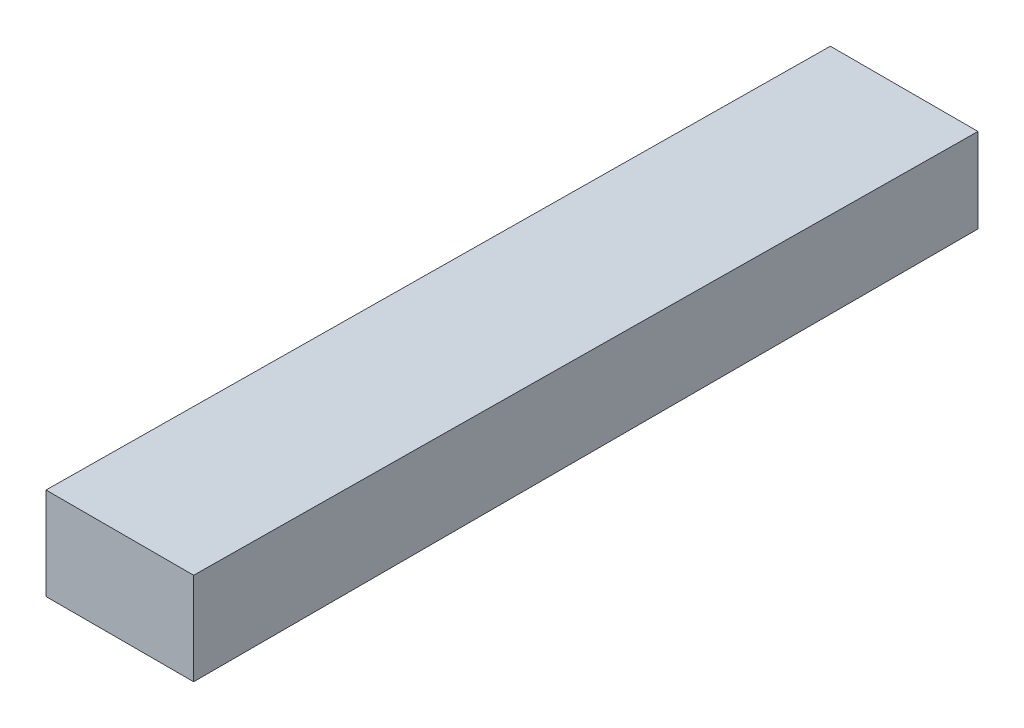
ISO-10303-21;
HEADER;
FILE_DESCRIPTION(('STEP AP214'),'2;1');
FILE_NAME('part.step','',(''),(''),'','','');
FILE_SCHEMA(('AUTOMOTIVE_DESIGN { 1 0 10303 214 1 1 1 1 }'));
ENDSEC;
DATA;
#1=APPLICATION_CONTEXT('core data for automotive mechanical design processes');
#2=APPLICATION_PROTOCOL_DEFINITION('international standard','automotive_design',2000,#1);
#3=PRODUCT_CONTEXT('',#1,'mechanical');
#4=PRODUCT('Part','Part','',(#3));
#5=PRODUCT_RELATED_PRODUCT_CATEGORY('part','',(#4));
#6=PRODUCT_DEFINITION_FORMATION('','',#4);
#7=PRODUCT_DEFINITION_CONTEXT('part definition',#1,'design');
#8=PRODUCT_DEFINITION('design','',#6,#7);
#9=PRODUCT_DEFINITION_SHAPE('','',#8);
#10=(LENGTH_UNIT() NAMED_UNIT(*) SI_UNIT(.MILLI.,.METRE.));
#11=(NAMED_UNIT(*) PLANE_ANGLE_UNIT() SI_UNIT($,.RADIAN.));
#12=(NAMED_UNIT(*) SI_UNIT($,.STERADIAN.) SOLID_ANGLE_UNIT());
#13=UNCERTAINTY_MEASURE_WITH_UNIT(LENGTH_MEASURE(1.E-05),#10,'distance_accuracy_value','');
#14=(GEOMETRIC_REPRESENTATION_CONTEXT(3) GLOBAL_UNCERTAINTY_ASSIGNED_CONTEXT((#13)) GLOBAL_UNIT_ASSIGNED_CONTEXT((#10,
#11,#12)) REPRESENTATION_CONTEXT('',''));
#15=CARTESIAN_POINT('',(0.,0.,0.));
#16=DIRECTION('',(0.,0.,1.));
#17=DIRECTION('',(1.,0.,0.));
#18=AXIS2_PLACEMENT_3D('',#15,#16,#17);
#19=CARTESIAN_POINT('',(0.,0.,42.5));
#20=DIRECTION('',(1.,0.,0.));
#21=DIRECTION('',(0.,0.,-1.));
#22=AXIS2_PLACEMENT_3D('',#19,#20,#21);
#23=PLANE('',#22);
#24=DIRECTION('',(0.,-1.,0.));
#25=VECTOR('',#24,1.);
#26=CARTESIAN_POINT('',(0.,0.,42.5));
#27=LINE('',#26,#25);
#28=CARTESIAN_POINT('',(0.,10.,42.5));
#29=VERTEX_POINT('',#28);
#30=CARTESIAN_POINT('',(0.,0.,42.5));
#31=VERTEX_POINT('',#30);
#32=EDGE_CURVE('E102',#29,#31,#27,.T.);
#33=ORIENTED_EDGE('',*,*,#32,.F.);
#34=DIRECTION('',(0.,0.00999950003749688,0.999950003749687));
#35=VECTOR('',#34,1.);
#36=CARTESIAN_POINT('',(0.,9.15,-42.5));
#37=LINE('',#36,#35);
#38=CARTESIAN_POINT('',(0.,9.15,-42.5));
#39=VERTEX_POINT('',#38);
#40=EDGE_CURVE('E120',#39,#29,#37,.T.);
#41=ORIENTED_EDGE('',*,*,#40,.F.);
#42=DIRECTION('',(0.,-1.,0.));
#43=VECTOR('',#42,1.);
#44=CARTESIAN_POINT('',(0.,0.,-42.5));
#45=LINE('',#44,#43);
#46=CARTESIAN_POINT('',(0.,0.,-42.5));
#47=VERTEX_POINT('',#46);
#48=EDGE_CURVE('E91',#39,#47,#45,.T.);
#49=ORIENTED_EDGE('',*,*,#48,.T.);
#50=DIRECTION('',(0.,0.,-1.));
#51=VECTOR('',#50,1.);
#52=CARTESIAN_POINT('',(0.,0.,42.5));
#53=LINE('',#52,#51);
#54=EDGE_CURVE('E52',#31,#47,#53,.T.);
#55=ORIENTED_EDGE('',*,*,#54,.F.);
#56=EDGE_LOOP('',(#33,#41,#49,#55));
#57=FACE_BOUND('',#56,.T.);
#58=ADVANCED_FACE('F44',(#57),#23,.F.);
#59=CARTESIAN_POINT('',(0.,0.,42.5));
#60=DIRECTION('',(0.,1.,0.));
#61=DIRECTION('',(0.,0.,1.));
#62=AXIS2_PLACEMENT_3D('',#59,#60,#61);
#63=PLANE('',#62);
#64=DIRECTION('',(1.,0.,0.));
#65=VECTOR('',#64,1.);
#66=CARTESIAN_POINT('',(0.,0.,-42.5));
#67=LINE('',#66,#65);
#68=CARTESIAN_POINT('',(16.,0.,-42.5));
#69=VERTEX_POINT('',#68);
#70=EDGE_CURVE('E80',#47,#69,#67,.T.);
#71=ORIENTED_EDGE('',*,*,#70,.T.);
#72=DIRECTION('',(0.,0.,-1.));
#73=VECTOR('',#72,1.);
#74=CARTESIAN_POINT('',(16.,0.,42.5));
#75=LINE('',#74,#73);
#76=CARTESIAN_POINT('',(16.,0.,42.5));
#77=VERTEX_POINT('',#76);
#78=EDGE_CURVE('E83',#77,#69,#75,.T.);
#79=ORIENTED_EDGE('',*,*,#78,.F.);
#80=DIRECTION('',(1.,0.,0.));
#81=VECTOR('',#80,1.);
#82=CARTESIAN_POINT('',(0.,0.,42.5));
#83=LINE('',#82,#81);
#84=EDGE_CURVE('E67',#31,#77,#83,.T.);
#85=ORIENTED_EDGE('',*,*,#84,.F.);
#86=ORIENTED_EDGE('',*,*,#54,.T.);
#87=EDGE_LOOP('',(#71,#79,#85,#86));
#88=FACE_BOUND('',#87,.T.);
#89=ADVANCED_FACE('F82',(#88),#63,.F.);
#90=CARTESIAN_POINT('',(16.,0.,42.5));
#91=DIRECTION('',(-1.,0.,0.));
#92=DIRECTION('',(0.,0.,1.));
#93=AXIS2_PLACEMENT_3D('',#90,#91,#92);
#94=PLANE('',#93);
#95=DIRECTION('',(0.,1.,0.));
#96=VECTOR('',#95,1.);
#97=CARTESIAN_POINT('',(16.,0.,-42.5));
#98=LINE('',#97,#96);
#99=CARTESIAN_POINT('',(16.,9.15,-42.5));
#100=VERTEX_POINT('',#99);
#101=EDGE_CURVE('E90',#69,#100,#98,.T.);
#102=ORIENTED_EDGE('',*,*,#101,.T.);
#103=DIRECTION('',(0.,0.00999950003749688,0.999950003749688));
#104=VECTOR('',#103,1.);
#105=CARTESIAN_POINT('',(16.,9.99900009999,42.4000099990001));
#106=LINE('',#105,#104);
#107=CARTESIAN_POINT('',(16.,10.,42.5));
#108=VERTEX_POINT('',#107);
#109=EDGE_CURVE('E58',#100,#108,#106,.T.);
#110=ORIENTED_EDGE('',*,*,#109,.T.);
#111=DIRECTION('',(0.,1.,0.));
#112=VECTOR('',#111,1.);
#113=CARTESIAN_POINT('',(16.,0.,42.5));
#114=LINE('',#113,#112);
#115=EDGE_CURVE('E96',#77,#108,#114,.T.);
#116=ORIENTED_EDGE('',*,*,#115,.F.);
#117=ORIENTED_EDGE('',*,*,#78,.T.);
#118=EDGE_LOOP('',(#102,#110,#116,#117));
#119=FACE_BOUND('',#118,.T.);
#120=ADVANCED_FACE('F95',(#119),#94,.F.);
#121=CARTESIAN_POINT('',(0.,0.,42.5));
#122=DIRECTION('',(0.,0.,-1.));
#123=DIRECTION('',(-1.,0.,0.));
#124=AXIS2_PLACEMENT_3D('',#121,#122,#123);
#125=PLANE('',#124);
#126=ORIENTED_EDGE('',*,*,#32,.T.);
#127=ORIENTED_EDGE('',*,*,#84,.T.);
#128=ORIENTED_EDGE('',*,*,#115,.T.);
#129=DIRECTION('',(-1.,0.,0.));
#130=VECTOR('',#129,1.);
#131=CARTESIAN_POINT('',(0.,10.,42.5));
#132=LINE('',#131,#130);
#133=EDGE_CURVE('E98',#108,#29,#132,.T.);
#134=ORIENTED_EDGE('',*,*,#133,.T.);
#135=EDGE_LOOP('',(#126,#127,#128,#134));
#136=FACE_BOUND('',#135,.T.);
#137=ADVANCED_FACE('F129',(#136),#125,.F.);
#138=CARTESIAN_POINT('',(0.,0.,-42.5));
#139=DIRECTION('',(0.,0.,-1.));
#140=DIRECTION('',(-1.,0.,0.));
#141=AXIS2_PLACEMENT_3D('',#138,#139,#140);
#142=PLANE('',#141);
#143=DIRECTION('',(-1.,0.,0.));
#144=VECTOR('',#143,1.);
#145=CARTESIAN_POINT('',(0.,9.15,-42.5));
#146=LINE('',#145,#144);
#147=EDGE_CURVE('E11',#100,#39,#146,.T.);
#148=ORIENTED_EDGE('',*,*,#147,.F.);
#149=ORIENTED_EDGE('',*,*,#101,.F.);
#150=ORIENTED_EDGE('',*,*,#70,.F.);
#151=ORIENTED_EDGE('',*,*,#48,.F.);
#152=EDGE_LOOP('',(#148,#149,#150,#151));
#153=FACE_BOUND('',#152,.T.);
#154=ADVANCED_FACE('F100',(#153),#142,.T.);
#155=CARTESIAN_POINT('',(85.,9.15,-42.5));
#156=DIRECTION('',(0.,-0.999950003749688,0.00999950003749688));
#157=DIRECTION('',(0.,-0.00999950003749688,-0.999950003749688));
#158=AXIS2_PLACEMENT_3D('',#155,#156,#157);
#159=PLANE('',#158);
#160=ORIENTED_EDGE('',*,*,#147,.T.);
#161=ORIENTED_EDGE('',*,*,#40,.T.);
#162=ORIENTED_EDGE('',*,*,#133,.F.);
#163=ORIENTED_EDGE('',*,*,#109,.F.);
#164=EDGE_LOOP('',(#160,#161,#162,#163));
#165=FACE_BOUND('',#164,.T.);
#166=ADVANCED_FACE('F125',(#165),#159,.F.);
#167=CLOSED_SHELL('',(#58,#89,#120,#137,#154,#166));
#168=MANIFOLD_SOLID_BREP('B2',#167);
#169=ADVANCED_BREP_SHAPE_REPRESENTATION('',(#18,#168),#14);
#170=SHAPE_DEFINITION_REPRESENTATION(#9,#169);
ENDSEC;
END-ISO-10303-21;
